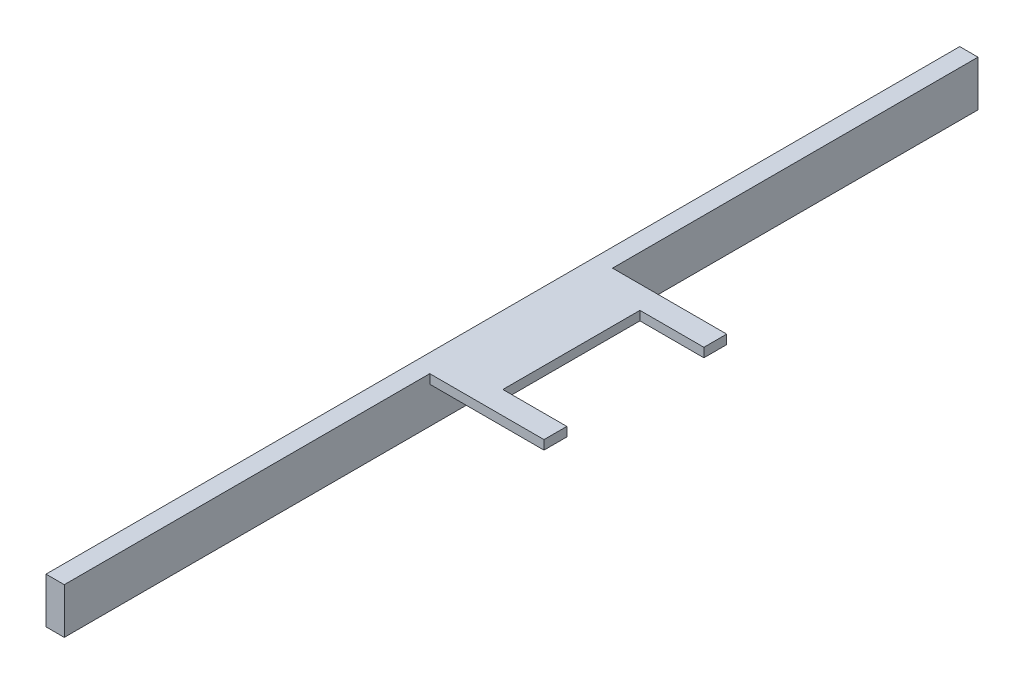
ISO-10303-21;
HEADER;
FILE_DESCRIPTION(('STEP AP214'),'2;1');
FILE_NAME('part.step','',(''),(''),'','','');
FILE_SCHEMA(('AUTOMOTIVE_DESIGN { 1 0 10303 214 1 1 1 1 }'));
ENDSEC;
DATA;
#1=APPLICATION_CONTEXT('core data for automotive mechanical design processes');
#2=APPLICATION_PROTOCOL_DEFINITION('international standard','automotive_design',2000,#1);
#3=PRODUCT_CONTEXT('',#1,'mechanical');
#4=PRODUCT('Part','Part','',(#3));
#5=PRODUCT_RELATED_PRODUCT_CATEGORY('part','',(#4));
#6=PRODUCT_DEFINITION_FORMATION('','',#4);
#7=PRODUCT_DEFINITION_CONTEXT('part definition',#1,'design');
#8=PRODUCT_DEFINITION('design','',#6,#7);
#9=PRODUCT_DEFINITION_SHAPE('','',#8);
#10=(LENGTH_UNIT() NAMED_UNIT(*) SI_UNIT(.MILLI.,.METRE.));
#11=(NAMED_UNIT(*) PLANE_ANGLE_UNIT() SI_UNIT($,.RADIAN.));
#12=(NAMED_UNIT(*) SI_UNIT($,.STERADIAN.) SOLID_ANGLE_UNIT());
#13=UNCERTAINTY_MEASURE_WITH_UNIT(LENGTH_MEASURE(1.E-05),#10,'distance_accuracy_value','');
#14=(GEOMETRIC_REPRESENTATION_CONTEXT(3) GLOBAL_UNCERTAINTY_ASSIGNED_CONTEXT((#13)) GLOBAL_UNIT_ASSIGNED_CONTEXT((#10,
#11,#12)) REPRESENTATION_CONTEXT('',''));
#15=CARTESIAN_POINT('',(0.,0.,0.));
#16=DIRECTION('',(0.,0.,1.));
#17=DIRECTION('',(1.,0.,0.));
#18=AXIS2_PLACEMENT_3D('',#15,#16,#17);
#19=CARTESIAN_POINT('',(14.5,5.,100.));
#20=DIRECTION('',(-1.,0.,0.));
#21=DIRECTION('',(0.,0.,1.));
#22=AXIS2_PLACEMENT_3D('',#19,#20,#21);
#23=PLANE('',#22);
#24=DIRECTION('',(0.,0.,-1.));
#25=VECTOR('',#24,1.);
#26=CARTESIAN_POINT('',(14.5,5.,100.));
#27=LINE('',#26,#25);
#28=CARTESIAN_POINT('',(14.5,5.,60.));
#29=VERTEX_POINT('',#28);
#30=CARTESIAN_POINT('',(14.5,5.,57.5));
#31=VERTEX_POINT('',#30);
#32=EDGE_CURVE('E162',#29,#31,#27,.T.);
#33=ORIENTED_EDGE('',*,*,#32,.F.);
#34=DIRECTION('',(0.,1.,0.));
#35=VECTOR('',#34,1.);
#36=CARTESIAN_POINT('',(14.5,-6.,60.));
#37=LINE('',#36,#35);
#38=CARTESIAN_POINT('',(14.5,4.,60.));
#39=VERTEX_POINT('',#38);
#40=EDGE_CURVE('E180',#39,#29,#37,.T.);
#41=ORIENTED_EDGE('',*,*,#40,.F.);
#42=DIRECTION('',(0.,0.,-1.));
#43=VECTOR('',#42,1.);
#44=CARTESIAN_POINT('',(14.5,4.,100.));
#45=LINE('',#44,#43);
#46=CARTESIAN_POINT('',(14.5,4.,57.5));
#47=VERTEX_POINT('',#46);
#48=EDGE_CURVE('E166',#39,#47,#45,.T.);
#49=ORIENTED_EDGE('',*,*,#48,.T.);
#50=DIRECTION('',(0.,1.,0.));
#51=VECTOR('',#50,1.);
#52=CARTESIAN_POINT('',(14.5,-6.,57.5));
#53=LINE('',#52,#51);
#54=EDGE_CURVE('E178',#47,#31,#53,.T.);
#55=ORIENTED_EDGE('',*,*,#54,.T.);
#56=EDGE_LOOP('',(#33,#41,#49,#55));
#57=FACE_BOUND('',#56,.T.);
#58=ADVANCED_FACE('F33',(#57),#23,.F.);
#59=CARTESIAN_POINT('',(0.,0.,100.));
#60=DIRECTION('',(1.,0.,0.));
#61=DIRECTION('',(0.,0.,-1.));
#62=AXIS2_PLACEMENT_3D('',#59,#60,#61);
#63=PLANE('',#62);
#64=DIRECTION('',(0.,-1.,0.));
#65=VECTOR('',#64,1.);
#66=CARTESIAN_POINT('',(0.,0.,0.));
#67=LINE('',#66,#65);
#68=CARTESIAN_POINT('',(0.,5.,0.));
#69=VERTEX_POINT('',#68);
#70=CARTESIAN_POINT('',(0.,0.,0.));
#71=VERTEX_POINT('',#70);
#72=EDGE_CURVE('E149',#69,#71,#67,.T.);
#73=ORIENTED_EDGE('',*,*,#72,.T.);
#74=DIRECTION('',(0.,0.,-1.));
#75=VECTOR('',#74,1.);
#76=CARTESIAN_POINT('',(0.,0.,100.));
#77=LINE('',#76,#75);
#78=CARTESIAN_POINT('',(0.,0.,100.));
#79=VERTEX_POINT('',#78);
#80=EDGE_CURVE('E11',#79,#71,#77,.T.);
#81=ORIENTED_EDGE('',*,*,#80,.F.);
#82=DIRECTION('',(0.,-1.,0.));
#83=VECTOR('',#82,1.);
#84=CARTESIAN_POINT('',(0.,0.,100.));
#85=LINE('',#84,#83);
#86=CARTESIAN_POINT('',(0.,5.,100.));
#87=VERTEX_POINT('',#86);
#88=EDGE_CURVE('E150',#87,#79,#85,.T.);
#89=ORIENTED_EDGE('',*,*,#88,.F.);
#90=DIRECTION('',(0.,0.,-1.));
#91=VECTOR('',#90,1.);
#92=CARTESIAN_POINT('',(0.,5.,100.));
#93=LINE('',#92,#91);
#94=EDGE_CURVE('E157',#87,#69,#93,.T.);
#95=ORIENTED_EDGE('',*,*,#94,.T.);
#96=EDGE_LOOP('',(#73,#81,#89,#95));
#97=FACE_BOUND('',#96,.T.);
#98=ADVANCED_FACE('F35',(#97),#63,.F.);
#99=CARTESIAN_POINT('',(0.,0.,100.));
#100=DIRECTION('',(0.,1.,0.));
#101=DIRECTION('',(0.,0.,1.));
#102=AXIS2_PLACEMENT_3D('',#99,#100,#101);
#103=PLANE('',#102);
#104=DIRECTION('',(1.,0.,0.));
#105=VECTOR('',#104,1.);
#106=CARTESIAN_POINT('',(0.,0.,0.));
#107=LINE('',#106,#105);
#108=CARTESIAN_POINT('',(2.,0.,0.));
#109=VERTEX_POINT('',#108);
#110=EDGE_CURVE('E135',#71,#109,#107,.T.);
#111=ORIENTED_EDGE('',*,*,#110,.T.);
#112=DIRECTION('',(0.,0.,-1.));
#113=VECTOR('',#112,1.);
#114=CARTESIAN_POINT('',(2.,0.,100.));
#115=LINE('',#114,#113);
#116=CARTESIAN_POINT('',(2.,0.,100.));
#117=VERTEX_POINT('',#116);
#118=EDGE_CURVE('E41',#117,#109,#115,.T.);
#119=ORIENTED_EDGE('',*,*,#118,.F.);
#120=DIRECTION('',(1.,0.,0.));
#121=VECTOR('',#120,1.);
#122=CARTESIAN_POINT('',(0.,0.,100.));
#123=LINE('',#122,#121);
#124=EDGE_CURVE('E153',#79,#117,#123,.T.);
#125=ORIENTED_EDGE('',*,*,#124,.F.);
#126=ORIENTED_EDGE('',*,*,#80,.T.);
#127=EDGE_LOOP('',(#111,#119,#125,#126));
#128=FACE_BOUND('',#127,.T.);
#129=ADVANCED_FACE('F202',(#128),#103,.F.);
#130=CARTESIAN_POINT('',(2.,0.,100.));
#131=DIRECTION('',(-1.,0.,0.));
#132=DIRECTION('',(0.,0.,1.));
#133=AXIS2_PLACEMENT_3D('',#130,#131,#132);
#134=PLANE('',#133);
#135=DIRECTION('',(0.,0.,-1.));
#136=VECTOR('',#135,1.);
#137=CARTESIAN_POINT('',(2.,4.,100.));
#138=LINE('',#137,#136);
#139=CARTESIAN_POINT('',(2.,4.,60.));
#140=VERTEX_POINT('',#139);
#141=CARTESIAN_POINT('',(2.,4.,40.));
#142=VERTEX_POINT('',#141);
#143=EDGE_CURVE('E167',#140,#142,#138,.T.);
#144=ORIENTED_EDGE('',*,*,#143,.F.);
#145=DIRECTION('',(0.,1.,0.));
#146=VECTOR('',#145,1.);
#147=CARTESIAN_POINT('',(2.,-6.,60.));
#148=LINE('',#147,#146);
#149=CARTESIAN_POINT('',(2.,5.,60.));
#150=VERTEX_POINT('',#149);
#151=EDGE_CURVE('E144',#140,#150,#148,.T.);
#152=ORIENTED_EDGE('',*,*,#151,.T.);
#153=DIRECTION('',(0.,0.,1.));
#154=VECTOR('',#153,1.);
#155=CARTESIAN_POINT('',(2.,5.,100.));
#156=LINE('',#155,#154);
#157=CARTESIAN_POINT('',(2.,5.,100.));
#158=VERTEX_POINT('',#157);
#159=EDGE_CURVE('E208',#150,#158,#156,.T.);
#160=ORIENTED_EDGE('',*,*,#159,.T.);
#161=DIRECTION('',(0.,1.,0.));
#162=VECTOR('',#161,1.);
#163=CARTESIAN_POINT('',(2.,0.,100.));
#164=LINE('',#163,#162);
#165=EDGE_CURVE('E56',#117,#158,#164,.T.);
#166=ORIENTED_EDGE('',*,*,#165,.F.);
#167=ORIENTED_EDGE('',*,*,#118,.T.);
#168=DIRECTION('',(0.,1.,0.));
#169=VECTOR('',#168,1.);
#170=CARTESIAN_POINT('',(2.,0.,0.));
#171=LINE('',#170,#169);
#172=CARTESIAN_POINT('',(2.,5.,0.));
#173=VERTEX_POINT('',#172);
#174=EDGE_CURVE('E123',#109,#173,#171,.T.);
#175=ORIENTED_EDGE('',*,*,#174,.T.);
#176=DIRECTION('',(0.,0.,1.));
#177=VECTOR('',#176,1.);
#178=CARTESIAN_POINT('',(2.,5.,0.));
#179=LINE('',#178,#177);
#180=CARTESIAN_POINT('',(2.,5.,40.));
#181=VERTEX_POINT('',#180);
#182=EDGE_CURVE('E128',#173,#181,#179,.T.);
#183=ORIENTED_EDGE('',*,*,#182,.T.);
#184=DIRECTION('',(0.,1.,0.));
#185=VECTOR('',#184,1.);
#186=CARTESIAN_POINT('',(2.,-6.,40.));
#187=LINE('',#186,#185);
#188=EDGE_CURVE('E237',#142,#181,#187,.T.);
#189=ORIENTED_EDGE('',*,*,#188,.F.);
#190=EDGE_LOOP('',(#144,#152,#160,#166,#167,#175,#183,#189));
#191=FACE_BOUND('',#190,.T.);
#192=ADVANCED_FACE('F126',(#191),#134,.F.);
#193=CARTESIAN_POINT('',(2.,4.,100.));
#194=DIRECTION('',(0.,1.,0.));
#195=DIRECTION('',(0.,0.,1.));
#196=AXIS2_PLACEMENT_3D('',#193,#194,#195);
#197=PLANE('',#196);
#198=ORIENTED_EDGE('',*,*,#48,.F.);
#199=DIRECTION('',(-1.,0.,0.));
#200=VECTOR('',#199,1.);
#201=CARTESIAN_POINT('',(1.99999999999998,4.,60.));
#202=LINE('',#201,#200);
#203=EDGE_CURVE('E183',#39,#140,#202,.T.);
#204=ORIENTED_EDGE('',*,*,#203,.T.);
#205=ORIENTED_EDGE('',*,*,#143,.T.);
#206=DIRECTION('',(1.,0.,0.));
#207=VECTOR('',#206,1.);
#208=CARTESIAN_POINT('',(2.,4.,40.));
#209=LINE('',#208,#207);
#210=CARTESIAN_POINT('',(14.5,4.,40.));
#211=VERTEX_POINT('',#210);
#212=EDGE_CURVE('E190',#142,#211,#209,.T.);
#213=ORIENTED_EDGE('',*,*,#212,.T.);
#214=CARTESIAN_POINT('',(14.5,4.,42.5));
#215=VERTEX_POINT('',#214);
#216=EDGE_CURVE('E163',#215,#211,#45,.T.);
#217=ORIENTED_EDGE('',*,*,#216,.F.);
#218=DIRECTION('',(-1.,0.,0.));
#219=VECTOR('',#218,1.);
#220=CARTESIAN_POINT('',(2.,4.,42.5));
#221=LINE('',#220,#219);
#222=CARTESIAN_POINT('',(7.5,4.,42.5));
#223=VERTEX_POINT('',#222);
#224=EDGE_CURVE('E193',#215,#223,#221,.T.);
#225=ORIENTED_EDGE('',*,*,#224,.T.);
#226=DIRECTION('',(0.,0.,1.));
#227=VECTOR('',#226,1.);
#228=CARTESIAN_POINT('',(7.50000000000001,4.,100.));
#229=LINE('',#228,#227);
#230=CARTESIAN_POINT('',(7.5,4.,57.5));
#231=VERTEX_POINT('',#230);
#232=EDGE_CURVE('E187',#223,#231,#229,.T.);
#233=ORIENTED_EDGE('',*,*,#232,.T.);
#234=DIRECTION('',(1.,0.,0.));
#235=VECTOR('',#234,1.);
#236=CARTESIAN_POINT('',(2.,4.,57.5));
#237=LINE('',#236,#235);
#238=EDGE_CURVE('E185',#231,#47,#237,.T.);
#239=ORIENTED_EDGE('',*,*,#238,.T.);
#240=EDGE_LOOP('',(#198,#204,#205,#213,#217,#225,#233,#239));
#241=FACE_BOUND('',#240,.T.);
#242=ADVANCED_FACE('F182',(#241),#197,.F.);
#243=ORIENTED_EDGE('',*,*,#216,.T.);
#244=DIRECTION('',(0.,1.,0.));
#245=VECTOR('',#244,1.);
#246=CARTESIAN_POINT('',(14.5,-6.,40.));
#247=LINE('',#246,#245);
#248=CARTESIAN_POINT('',(14.5,5.,40.));
#249=VERTEX_POINT('',#248);
#250=EDGE_CURVE('E235',#211,#249,#247,.T.);
#251=ORIENTED_EDGE('',*,*,#250,.T.);
#252=CARTESIAN_POINT('',(14.5,5.,42.5));
#253=VERTEX_POINT('',#252);
#254=EDGE_CURVE('E159',#253,#249,#27,.T.);
#255=ORIENTED_EDGE('',*,*,#254,.F.);
#256=DIRECTION('',(0.,1.,0.));
#257=VECTOR('',#256,1.);
#258=CARTESIAN_POINT('',(14.5,-6.,42.5));
#259=LINE('',#258,#257);
#260=EDGE_CURVE('E48',#215,#253,#259,.T.);
#261=ORIENTED_EDGE('',*,*,#260,.F.);
#262=EDGE_LOOP('',(#243,#251,#255,#261));
#263=FACE_BOUND('',#262,.T.);
#264=ADVANCED_FACE('F218',(#263),#23,.F.);
#265=CARTESIAN_POINT('',(0.,5.,100.));
#266=DIRECTION('',(0.,-1.,0.));
#267=DIRECTION('',(0.,0.,-1.));
#268=AXIS2_PLACEMENT_3D('',#265,#266,#267);
#269=PLANE('',#268);
#270=DIRECTION('',(-1.,0.,0.));
#271=VECTOR('',#270,1.);
#272=CARTESIAN_POINT('',(2.,5.,100.));
#273=LINE('',#272,#271);
#274=EDGE_CURVE('E160',#158,#87,#273,.T.);
#275=ORIENTED_EDGE('',*,*,#274,.F.);
#276=ORIENTED_EDGE('',*,*,#159,.F.);
#277=DIRECTION('',(-1.,0.,0.));
#278=VECTOR('',#277,1.);
#279=CARTESIAN_POINT('',(14.5,5.,60.));
#280=LINE('',#279,#278);
#281=EDGE_CURVE('E243',#29,#150,#280,.T.);
#282=ORIENTED_EDGE('',*,*,#281,.F.);
#283=ORIENTED_EDGE('',*,*,#32,.T.);
#284=DIRECTION('',(1.,0.,0.));
#285=VECTOR('',#284,1.);
#286=CARTESIAN_POINT('',(14.5,5.,57.5));
#287=LINE('',#286,#285);
#288=CARTESIAN_POINT('',(7.5,5.,57.5));
#289=VERTEX_POINT('',#288);
#290=EDGE_CURVE('E253',#289,#31,#287,.T.);
#291=ORIENTED_EDGE('',*,*,#290,.F.);
#292=DIRECTION('',(0.,0.,1.));
#293=VECTOR('',#292,1.);
#294=CARTESIAN_POINT('',(7.5,5.,57.5));
#295=LINE('',#294,#293);
#296=CARTESIAN_POINT('',(7.5,5.,42.5));
#297=VERTEX_POINT('',#296);
#298=EDGE_CURVE('E250',#297,#289,#295,.T.);
#299=ORIENTED_EDGE('',*,*,#298,.F.);
#300=DIRECTION('',(-1.,0.,0.));
#301=VECTOR('',#300,1.);
#302=CARTESIAN_POINT('',(14.5,5.,42.5));
#303=LINE('',#302,#301);
#304=EDGE_CURVE('E239',#253,#297,#303,.T.);
#305=ORIENTED_EDGE('',*,*,#304,.F.);
#306=ORIENTED_EDGE('',*,*,#254,.T.);
#307=DIRECTION('',(1.,0.,0.));
#308=VECTOR('',#307,1.);
#309=CARTESIAN_POINT('',(14.5,5.,40.));
#310=LINE('',#309,#308);
#311=EDGE_CURVE('E143',#181,#249,#310,.T.);
#312=ORIENTED_EDGE('',*,*,#311,.F.);
#313=ORIENTED_EDGE('',*,*,#182,.F.);
#314=DIRECTION('',(-1.,0.,0.));
#315=VECTOR('',#314,1.);
#316=CARTESIAN_POINT('',(0.,5.,0.));
#317=LINE('',#316,#315);
#318=EDGE_CURVE('E134',#173,#69,#317,.T.);
#319=ORIENTED_EDGE('',*,*,#318,.T.);
#320=ORIENTED_EDGE('',*,*,#94,.F.);
#321=EDGE_LOOP('',(#275,#276,#282,#283,#291,#299,#305,#306,#312,#313,#319,#320));
#322=FACE_BOUND('',#321,.T.);
#323=ADVANCED_FACE('F139',(#322),#269,.F.);
#324=CARTESIAN_POINT('',(0.,0.,100.));
#325=DIRECTION('',(0.,0.,-1.));
#326=DIRECTION('',(-1.,0.,0.));
#327=AXIS2_PLACEMENT_3D('',#324,#325,#326);
#328=PLANE('',#327);
#329=ORIENTED_EDGE('',*,*,#165,.T.);
#330=ORIENTED_EDGE('',*,*,#274,.T.);
#331=ORIENTED_EDGE('',*,*,#88,.T.);
#332=ORIENTED_EDGE('',*,*,#124,.T.);
#333=EDGE_LOOP('',(#329,#330,#331,#332));
#334=FACE_BOUND('',#333,.T.);
#335=ADVANCED_FACE('F209',(#334),#328,.F.);
#336=CARTESIAN_POINT('',(0.,0.,0.));
#337=DIRECTION('',(0.,0.,-1.));
#338=DIRECTION('',(-1.,0.,0.));
#339=AXIS2_PLACEMENT_3D('',#336,#337,#338);
#340=PLANE('',#339);
#341=ORIENTED_EDGE('',*,*,#318,.F.);
#342=ORIENTED_EDGE('',*,*,#174,.F.);
#343=ORIENTED_EDGE('',*,*,#110,.F.);
#344=ORIENTED_EDGE('',*,*,#72,.F.);
#345=EDGE_LOOP('',(#341,#342,#343,#344));
#346=FACE_BOUND('',#345,.T.);
#347=ADVANCED_FACE('F147',(#346),#340,.T.);
#348=CARTESIAN_POINT('',(14.5,-6.,40.));
#349=DIRECTION('',(0.,0.,1.));
#350=DIRECTION('',(1.,0.,0.));
#351=AXIS2_PLACEMENT_3D('',#348,#349,#350);
#352=PLANE('',#351);
#353=ORIENTED_EDGE('',*,*,#188,.T.);
#354=ORIENTED_EDGE('',*,*,#311,.T.);
#355=ORIENTED_EDGE('',*,*,#250,.F.);
#356=ORIENTED_EDGE('',*,*,#212,.F.);
#357=EDGE_LOOP('',(#353,#354,#355,#356));
#358=FACE_BOUND('',#357,.T.);
#359=ADVANCED_FACE('F216',(#358),#352,.F.);
#360=CARTESIAN_POINT('',(14.5,-6.,60.));
#361=DIRECTION('',(0.,0.,-1.));
#362=DIRECTION('',(-1.,0.,0.));
#363=AXIS2_PLACEMENT_3D('',#360,#361,#362);
#364=PLANE('',#363);
#365=ORIENTED_EDGE('',*,*,#40,.T.);
#366=ORIENTED_EDGE('',*,*,#281,.T.);
#367=ORIENTED_EDGE('',*,*,#151,.F.);
#368=ORIENTED_EDGE('',*,*,#203,.F.);
#369=EDGE_LOOP('',(#365,#366,#367,#368));
#370=FACE_BOUND('',#369,.T.);
#371=ADVANCED_FACE('F268',(#370),#364,.F.);
#372=CARTESIAN_POINT('',(14.5,-6.,57.5));
#373=DIRECTION('',(0.,0.,1.));
#374=DIRECTION('',(1.,0.,0.));
#375=AXIS2_PLACEMENT_3D('',#372,#373,#374);
#376=PLANE('',#375);
#377=DIRECTION('',(0.,1.,0.));
#378=VECTOR('',#377,1.);
#379=CARTESIAN_POINT('',(7.5,-6.,57.5));
#380=LINE('',#379,#378);
#381=EDGE_CURVE('E256',#231,#289,#380,.T.);
#382=ORIENTED_EDGE('',*,*,#381,.T.);
#383=ORIENTED_EDGE('',*,*,#290,.T.);
#384=ORIENTED_EDGE('',*,*,#54,.F.);
#385=ORIENTED_EDGE('',*,*,#238,.F.);
#386=EDGE_LOOP('',(#382,#383,#384,#385));
#387=FACE_BOUND('',#386,.T.);
#388=ADVANCED_FACE('F266',(#387),#376,.F.);
#389=CARTESIAN_POINT('',(7.5,-6.,57.5));
#390=DIRECTION('',(-1.,0.,0.));
#391=DIRECTION('',(0.,0.,1.));
#392=AXIS2_PLACEMENT_3D('',#389,#390,#391);
#393=PLANE('',#392);
#394=DIRECTION('',(0.,1.,0.));
#395=VECTOR('',#394,1.);
#396=CARTESIAN_POINT('',(7.5,-6.,42.5));
#397=LINE('',#396,#395);
#398=EDGE_CURVE('E258',#223,#297,#397,.T.);
#399=ORIENTED_EDGE('',*,*,#398,.T.);
#400=ORIENTED_EDGE('',*,*,#298,.T.);
#401=ORIENTED_EDGE('',*,*,#381,.F.);
#402=ORIENTED_EDGE('',*,*,#232,.F.);
#403=EDGE_LOOP('',(#399,#400,#401,#402));
#404=FACE_BOUND('',#403,.T.);
#405=ADVANCED_FACE('F262',(#404),#393,.F.);
#406=CARTESIAN_POINT('',(14.5,-6.,42.5));
#407=DIRECTION('',(0.,0.,-1.));
#408=DIRECTION('',(-1.,0.,0.));
#409=AXIS2_PLACEMENT_3D('',#406,#407,#408);
#410=PLANE('',#409);
#411=ORIENTED_EDGE('',*,*,#260,.T.);
#412=ORIENTED_EDGE('',*,*,#304,.T.);
#413=ORIENTED_EDGE('',*,*,#398,.F.);
#414=ORIENTED_EDGE('',*,*,#224,.F.);
#415=EDGE_LOOP('',(#411,#412,#413,#414));
#416=FACE_BOUND('',#415,.T.);
#417=ADVANCED_FACE('F265',(#416),#410,.F.);
#418=CLOSED_SHELL('',(#58,#98,#129,#192,#242,#264,#323,#335,#347,#359,#371,#388,#405,#417));
#419=MANIFOLD_SOLID_BREP('B2',#418);
#420=ADVANCED_BREP_SHAPE_REPRESENTATION('',(#18,#419),#14);
#421=SHAPE_DEFINITION_REPRESENTATION(#9,#420);
ENDSEC;
END-ISO-10303-21;
